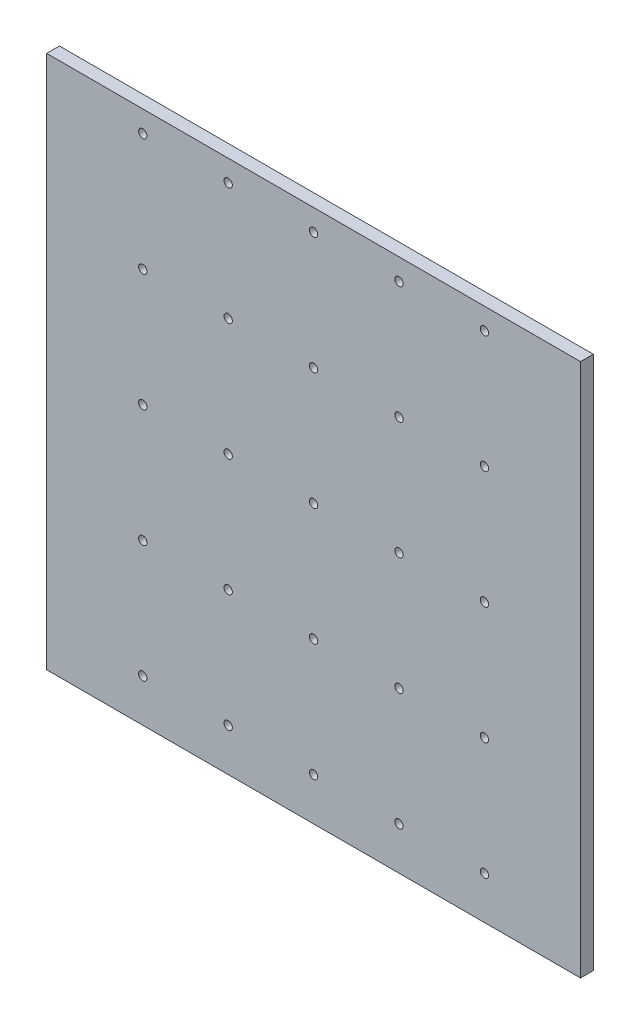
ISO-10303-21;
HEADER;
FILE_DESCRIPTION(('STEP AP214'),'2;1');
FILE_NAME('part.step','',(''),(''),'','','');
FILE_SCHEMA(('AUTOMOTIVE_DESIGN { 1 0 10303 214 1 1 1 1 }'));
ENDSEC;
DATA;
#1=APPLICATION_CONTEXT('core data for automotive mechanical design processes');
#2=APPLICATION_PROTOCOL_DEFINITION('international standard','automotive_design',2000,#1);
#3=PRODUCT_CONTEXT('',#1,'mechanical');
#4=PRODUCT('Part','Part','',(#3));
#5=PRODUCT_RELATED_PRODUCT_CATEGORY('part','',(#4));
#6=PRODUCT_DEFINITION_FORMATION('','',#4);
#7=PRODUCT_DEFINITION_CONTEXT('part definition',#1,'design');
#8=PRODUCT_DEFINITION('design','',#6,#7);
#9=PRODUCT_DEFINITION_SHAPE('','',#8);
#10=(LENGTH_UNIT() NAMED_UNIT(*) SI_UNIT(.MILLI.,.METRE.));
#11=(NAMED_UNIT(*) PLANE_ANGLE_UNIT() SI_UNIT($,.RADIAN.));
#12=(NAMED_UNIT(*) SI_UNIT($,.STERADIAN.) SOLID_ANGLE_UNIT());
#13=UNCERTAINTY_MEASURE_WITH_UNIT(LENGTH_MEASURE(1.E-05),#10,'distance_accuracy_value','');
#14=(GEOMETRIC_REPRESENTATION_CONTEXT(3) GLOBAL_UNCERTAINTY_ASSIGNED_CONTEXT((#13)) GLOBAL_UNIT_ASSIGNED_CONTEXT((#10,
#11,#12)) REPRESENTATION_CONTEXT('',''));
#15=CARTESIAN_POINT('',(0.,0.,0.));
#16=DIRECTION('',(0.,0.,1.));
#17=DIRECTION('',(1.,0.,0.));
#18=AXIS2_PLACEMENT_3D('',#15,#16,#17);
#19=CARTESIAN_POINT('',(0.,0.,0.));
#20=DIRECTION('',(0.,0.,-1.));
#21=DIRECTION('',(-1.,0.,0.));
#22=AXIS2_PLACEMENT_3D('',#19,#20,#21);
#23=PLANE('',#22);
#24=CARTESIAN_POINT('',(45.,185.,0.));
#25=DIRECTION('',(0.,0.,1.));
#26=DIRECTION('',(1.,0.,0.));
#27=AXIS2_PLACEMENT_3D('',#24,#25,#26);
#28=CIRCLE('',#27,1.95);
#29=CARTESIAN_POINT('',(46.95,185.,0.));
#30=VERTEX_POINT('',#29);
#31=EDGE_CURVE('E251',#30,#30,#28,.T.);
#32=ORIENTED_EDGE('',*,*,#31,.T.);
#33=EDGE_LOOP('',(#32));
#34=FACE_BOUND('',#33,.T.);
#35=CARTESIAN_POINT('',(45.,75.,0.));
#36=DIRECTION('',(0.,0.,1.));
#37=DIRECTION('',(1.,0.,0.));
#38=AXIS2_PLACEMENT_3D('',#35,#36,#37);
#39=CIRCLE('',#38,1.95);
#40=CARTESIAN_POINT('',(46.95,75.,0.));
#41=VERTEX_POINT('',#40);
#42=EDGE_CURVE('E259',#41,#41,#39,.T.);
#43=ORIENTED_EDGE('',*,*,#42,.T.);
#44=EDGE_LOOP('',(#43));
#45=FACE_BOUND('',#44,.T.);
#46=CARTESIAN_POINT('',(205.,240.,0.));
#47=DIRECTION('',(0.,0.,1.));
#48=DIRECTION('',(1.,0.,0.));
#49=AXIS2_PLACEMENT_3D('',#46,#47,#48);
#50=CIRCLE('',#49,1.94999999999999);
#51=CARTESIAN_POINT('',(206.95,240.,0.));
#52=VERTEX_POINT('',#51);
#53=EDGE_CURVE('E43',#52,#52,#50,.T.);
#54=ORIENTED_EDGE('',*,*,#53,.T.);
#55=EDGE_LOOP('',(#54));
#56=FACE_BOUND('',#55,.T.);
#57=CARTESIAN_POINT('',(165.,240.,0.));
#58=DIRECTION('',(0.,0.,1.));
#59=DIRECTION('',(1.,0.,0.));
#60=AXIS2_PLACEMENT_3D('',#57,#58,#59);
#61=CIRCLE('',#60,1.94999999999999);
#62=CARTESIAN_POINT('',(166.95,240.,0.));
#63=VERTEX_POINT('',#62);
#64=EDGE_CURVE('E206',#63,#63,#61,.T.);
#65=ORIENTED_EDGE('',*,*,#64,.T.);
#66=EDGE_LOOP('',(#65));
#67=FACE_BOUND('',#66,.T.);
#68=CARTESIAN_POINT('',(125.,240.,0.));
#69=DIRECTION('',(0.,0.,1.));
#70=DIRECTION('',(1.,0.,0.));
#71=AXIS2_PLACEMENT_3D('',#68,#69,#70);
#72=CIRCLE('',#71,1.94999999999999);
#73=CARTESIAN_POINT('',(126.95,240.,0.));
#74=VERTEX_POINT('',#73);
#75=EDGE_CURVE('E200',#74,#74,#72,.T.);
#76=ORIENTED_EDGE('',*,*,#75,.T.);
#77=EDGE_LOOP('',(#76));
#78=FACE_BOUND('',#77,.T.);
#79=CARTESIAN_POINT('',(85.,240.,0.));
#80=DIRECTION('',(0.,0.,1.));
#81=DIRECTION('',(1.,0.,0.));
#82=AXIS2_PLACEMENT_3D('',#79,#80,#81);
#83=CIRCLE('',#82,1.94999999999999);
#84=CARTESIAN_POINT('',(86.95,240.,0.));
#85=VERTEX_POINT('',#84);
#86=EDGE_CURVE('E194',#85,#85,#83,.T.);
#87=ORIENTED_EDGE('',*,*,#86,.T.);
#88=EDGE_LOOP('',(#87));
#89=FACE_BOUND('',#88,.T.);
#90=CARTESIAN_POINT('',(205.,185.,0.));
#91=DIRECTION('',(0.,0.,1.));
#92=DIRECTION('',(1.,0.,0.));
#93=AXIS2_PLACEMENT_3D('',#90,#91,#92);
#94=CIRCLE('',#93,1.94999999999999);
#95=CARTESIAN_POINT('',(206.95,185.,0.));
#96=VERTEX_POINT('',#95);
#97=EDGE_CURVE('E188',#96,#96,#94,.T.);
#98=ORIENTED_EDGE('',*,*,#97,.T.);
#99=EDGE_LOOP('',(#98));
#100=FACE_BOUND('',#99,.T.);
#101=CARTESIAN_POINT('',(85.,185.,0.));
#102=DIRECTION('',(0.,0.,1.));
#103=DIRECTION('',(1.,0.,0.));
#104=AXIS2_PLACEMENT_3D('',#101,#102,#103);
#105=CIRCLE('',#104,1.94999999999999);
#106=CARTESIAN_POINT('',(86.95,185.,0.));
#107=VERTEX_POINT('',#106);
#108=EDGE_CURVE('E182',#107,#107,#105,.T.);
#109=ORIENTED_EDGE('',*,*,#108,.T.);
#110=EDGE_LOOP('',(#109));
#111=FACE_BOUND('',#110,.T.);
#112=CARTESIAN_POINT('',(205.,130.,0.));
#113=DIRECTION('',(0.,0.,1.));
#114=DIRECTION('',(1.,0.,0.));
#115=AXIS2_PLACEMENT_3D('',#112,#113,#114);
#116=CIRCLE('',#115,1.94999999999999);
#117=CARTESIAN_POINT('',(206.95,130.,0.));
#118=VERTEX_POINT('',#117);
#119=EDGE_CURVE('E176',#118,#118,#116,.T.);
#120=ORIENTED_EDGE('',*,*,#119,.T.);
#121=EDGE_LOOP('',(#120));
#122=FACE_BOUND('',#121,.T.);
#123=CARTESIAN_POINT('',(85.,130.,0.));
#124=DIRECTION('',(0.,0.,1.));
#125=DIRECTION('',(1.,0.,0.));
#126=AXIS2_PLACEMENT_3D('',#123,#124,#125);
#127=CIRCLE('',#126,1.94999999999999);
#128=CARTESIAN_POINT('',(86.95,130.,0.));
#129=VERTEX_POINT('',#128);
#130=EDGE_CURVE('E170',#129,#129,#127,.T.);
#131=ORIENTED_EDGE('',*,*,#130,.T.);
#132=EDGE_LOOP('',(#131));
#133=FACE_BOUND('',#132,.T.);
#134=CARTESIAN_POINT('',(205.,75.,0.));
#135=DIRECTION('',(0.,0.,1.));
#136=DIRECTION('',(1.,0.,0.));
#137=AXIS2_PLACEMENT_3D('',#134,#135,#136);
#138=CIRCLE('',#137,1.94999999999999);
#139=CARTESIAN_POINT('',(206.95,75.,0.));
#140=VERTEX_POINT('',#139);
#141=EDGE_CURVE('E164',#140,#140,#138,.T.);
#142=ORIENTED_EDGE('',*,*,#141,.T.);
#143=EDGE_LOOP('',(#142));
#144=FACE_BOUND('',#143,.T.);
#145=CARTESIAN_POINT('',(85.,75.,0.));
#146=DIRECTION('',(0.,0.,1.));
#147=DIRECTION('',(1.,0.,0.));
#148=AXIS2_PLACEMENT_3D('',#145,#146,#147);
#149=CIRCLE('',#148,1.94999999999999);
#150=CARTESIAN_POINT('',(86.95,75.,0.));
#151=VERTEX_POINT('',#150);
#152=EDGE_CURVE('E158',#151,#151,#149,.T.);
#153=ORIENTED_EDGE('',*,*,#152,.T.);
#154=EDGE_LOOP('',(#153));
#155=FACE_BOUND('',#154,.T.);
#156=CARTESIAN_POINT('',(205.,20.,0.));
#157=DIRECTION('',(0.,0.,1.));
#158=DIRECTION('',(1.,0.,0.));
#159=AXIS2_PLACEMENT_3D('',#156,#157,#158);
#160=CIRCLE('',#159,1.94999999999999);
#161=CARTESIAN_POINT('',(206.95,20.,0.));
#162=VERTEX_POINT('',#161);
#163=EDGE_CURVE('E152',#162,#162,#160,.T.);
#164=ORIENTED_EDGE('',*,*,#163,.T.);
#165=EDGE_LOOP('',(#164));
#166=FACE_BOUND('',#165,.T.);
#167=CARTESIAN_POINT('',(165.,20.,0.));
#168=DIRECTION('',(0.,0.,1.));
#169=DIRECTION('',(1.,0.,0.));
#170=AXIS2_PLACEMENT_3D('',#167,#168,#169);
#171=CIRCLE('',#170,1.94999999999999);
#172=CARTESIAN_POINT('',(166.95,20.,0.));
#173=VERTEX_POINT('',#172);
#174=EDGE_CURVE('E146',#173,#173,#171,.T.);
#175=ORIENTED_EDGE('',*,*,#174,.T.);
#176=EDGE_LOOP('',(#175));
#177=FACE_BOUND('',#176,.T.);
#178=CARTESIAN_POINT('',(165.,185.,0.));
#179=DIRECTION('',(0.,0.,1.));
#180=DIRECTION('',(1.,0.,0.));
#181=AXIS2_PLACEMENT_3D('',#178,#179,#180);
#182=CIRCLE('',#181,1.94999999999999);
#183=CARTESIAN_POINT('',(166.95,185.,0.));
#184=VERTEX_POINT('',#183);
#185=EDGE_CURVE('E140',#184,#184,#182,.T.);
#186=ORIENTED_EDGE('',*,*,#185,.T.);
#187=EDGE_LOOP('',(#186));
#188=FACE_BOUND('',#187,.T.);
#189=CARTESIAN_POINT('',(125.,185.,0.));
#190=DIRECTION('',(0.,0.,1.));
#191=DIRECTION('',(1.,0.,0.));
#192=AXIS2_PLACEMENT_3D('',#189,#190,#191);
#193=CIRCLE('',#192,1.94999999999999);
#194=CARTESIAN_POINT('',(126.95,185.,0.));
#195=VERTEX_POINT('',#194);
#196=EDGE_CURVE('E134',#195,#195,#193,.T.);
#197=ORIENTED_EDGE('',*,*,#196,.T.);
#198=EDGE_LOOP('',(#197));
#199=FACE_BOUND('',#198,.T.);
#200=CARTESIAN_POINT('',(165.,130.,0.));
#201=DIRECTION('',(0.,0.,1.));
#202=DIRECTION('',(1.,0.,0.));
#203=AXIS2_PLACEMENT_3D('',#200,#201,#202);
#204=CIRCLE('',#203,1.94999999999999);
#205=CARTESIAN_POINT('',(166.95,130.,0.));
#206=VERTEX_POINT('',#205);
#207=EDGE_CURVE('E128',#206,#206,#204,.T.);
#208=ORIENTED_EDGE('',*,*,#207,.T.);
#209=EDGE_LOOP('',(#208));
#210=FACE_BOUND('',#209,.T.);
#211=CARTESIAN_POINT('',(125.,130.,0.));
#212=DIRECTION('',(0.,0.,1.));
#213=DIRECTION('',(1.,0.,0.));
#214=AXIS2_PLACEMENT_3D('',#211,#212,#213);
#215=CIRCLE('',#214,1.94999999999999);
#216=CARTESIAN_POINT('',(126.95,130.,0.));
#217=VERTEX_POINT('',#216);
#218=EDGE_CURVE('E122',#217,#217,#215,.T.);
#219=ORIENTED_EDGE('',*,*,#218,.T.);
#220=EDGE_LOOP('',(#219));
#221=FACE_BOUND('',#220,.T.);
#222=CARTESIAN_POINT('',(165.,75.,0.));
#223=DIRECTION('',(0.,0.,1.));
#224=DIRECTION('',(1.,0.,0.));
#225=AXIS2_PLACEMENT_3D('',#222,#223,#224);
#226=CIRCLE('',#225,1.94999999999999);
#227=CARTESIAN_POINT('',(166.95,75.,0.));
#228=VERTEX_POINT('',#227);
#229=EDGE_CURVE('E114',#228,#228,#226,.T.);
#230=ORIENTED_EDGE('',*,*,#229,.T.);
#231=EDGE_LOOP('',(#230));
#232=FACE_BOUND('',#231,.T.);
#233=DIRECTION('',(0.,1.,0.));
#234=VECTOR('',#233,1.);
#235=CARTESIAN_POINT('',(0.,0.,0.));
#236=LINE('',#235,#234);
#237=CARTESIAN_POINT('',(0.,0.,0.));
#238=VERTEX_POINT('',#237);
#239=CARTESIAN_POINT('',(0.,250.,0.));
#240=VERTEX_POINT('',#239);
#241=EDGE_CURVE('E105',#238,#240,#236,.T.);
#242=ORIENTED_EDGE('',*,*,#241,.T.);
#243=DIRECTION('',(1.,0.,0.));
#244=VECTOR('',#243,1.);
#245=CARTESIAN_POINT('',(0.,250.,0.));
#246=LINE('',#245,#244);
#247=CARTESIAN_POINT('',(250.,250.,0.));
#248=VERTEX_POINT('',#247);
#249=EDGE_CURVE('E108',#240,#248,#246,.T.);
#250=ORIENTED_EDGE('',*,*,#249,.T.);
#251=DIRECTION('',(0.,1.,0.));
#252=VECTOR('',#251,1.);
#253=CARTESIAN_POINT('',(250.,0.,0.));
#254=LINE('',#253,#252);
#255=CARTESIAN_POINT('',(250.,0.,0.));
#256=VERTEX_POINT('',#255);
#257=EDGE_CURVE('E94',#256,#248,#254,.T.);
#258=ORIENTED_EDGE('',*,*,#257,.F.);
#259=DIRECTION('',(1.,0.,0.));
#260=VECTOR('',#259,1.);
#261=CARTESIAN_POINT('',(0.,0.,0.));
#262=LINE('',#261,#260);
#263=EDGE_CURVE('E68',#238,#256,#262,.T.);
#264=ORIENTED_EDGE('',*,*,#263,.F.);
#265=EDGE_LOOP('',(#242,#250,#258,#264));
#266=FACE_BOUND('',#265,.T.);
#267=CARTESIAN_POINT('',(85.,20.,0.));
#268=DIRECTION('',(0.,0.,1.));
#269=DIRECTION('',(1.,0.,0.));
#270=AXIS2_PLACEMENT_3D('',#267,#268,#269);
#271=CIRCLE('',#270,1.94999999999999);
#272=CARTESIAN_POINT('',(86.95,20.,0.));
#273=VERTEX_POINT('',#272);
#274=EDGE_CURVE('E109',#273,#273,#271,.T.);
#275=ORIENTED_EDGE('',*,*,#274,.T.);
#276=EDGE_LOOP('',(#275));
#277=FACE_BOUND('',#276,.T.);
#278=CARTESIAN_POINT('',(125.,75.,0.));
#279=DIRECTION('',(0.,0.,1.));
#280=DIRECTION('',(1.,0.,0.));
#281=AXIS2_PLACEMENT_3D('',#278,#279,#280);
#282=CIRCLE('',#281,1.94999999999999);
#283=CARTESIAN_POINT('',(126.95,75.,0.));
#284=VERTEX_POINT('',#283);
#285=EDGE_CURVE('E272',#284,#284,#282,.T.);
#286=ORIENTED_EDGE('',*,*,#285,.T.);
#287=EDGE_LOOP('',(#286));
#288=FACE_BOUND('',#287,.T.);
#289=CARTESIAN_POINT('',(125.,20.,0.));
#290=DIRECTION('',(0.,0.,1.));
#291=DIRECTION('',(1.,0.,0.));
#292=AXIS2_PLACEMENT_3D('',#289,#290,#291);
#293=CIRCLE('',#292,1.94999999999999);
#294=CARTESIAN_POINT('',(126.95,20.,0.));
#295=VERTEX_POINT('',#294);
#296=EDGE_CURVE('E266',#295,#295,#293,.T.);
#297=ORIENTED_EDGE('',*,*,#296,.T.);
#298=EDGE_LOOP('',(#297));
#299=FACE_BOUND('',#298,.T.);
#300=CARTESIAN_POINT('',(45.,20.,0.));
#301=DIRECTION('',(0.,0.,1.));
#302=DIRECTION('',(1.,0.,0.));
#303=AXIS2_PLACEMENT_3D('',#300,#301,#302);
#304=CIRCLE('',#303,1.95);
#305=CARTESIAN_POINT('',(46.95,20.,0.));
#306=VERTEX_POINT('',#305);
#307=EDGE_CURVE('E263',#306,#306,#304,.T.);
#308=ORIENTED_EDGE('',*,*,#307,.T.);
#309=EDGE_LOOP('',(#308));
#310=FACE_BOUND('',#309,.T.);
#311=CARTESIAN_POINT('',(45.,130.,0.));
#312=DIRECTION('',(0.,0.,1.));
#313=DIRECTION('',(1.,0.,0.));
#314=AXIS2_PLACEMENT_3D('',#311,#312,#313);
#315=CIRCLE('',#314,1.95);
#316=CARTESIAN_POINT('',(46.95,130.,0.));
#317=VERTEX_POINT('',#316);
#318=EDGE_CURVE('E255',#317,#317,#315,.T.);
#319=ORIENTED_EDGE('',*,*,#318,.T.);
#320=EDGE_LOOP('',(#319));
#321=FACE_BOUND('',#320,.T.);
#322=CARTESIAN_POINT('',(45.,240.,0.));
#323=DIRECTION('',(0.,0.,1.));
#324=DIRECTION('',(1.,0.,0.));
#325=AXIS2_PLACEMENT_3D('',#322,#323,#324);
#326=CIRCLE('',#325,1.95);
#327=CARTESIAN_POINT('',(46.95,240.,0.));
#328=VERTEX_POINT('',#327);
#329=EDGE_CURVE('E245',#328,#328,#326,.T.);
#330=ORIENTED_EDGE('',*,*,#329,.T.);
#331=EDGE_LOOP('',(#330));
#332=FACE_BOUND('',#331,.T.);
#333=ADVANCED_FACE('F34',(#34,#45,#56,#67,#78,#89,#100,#111,#122,#133,#144,#155,#166,#177,#188,
#199,#210,#221,#232,#266,#277,#288,#299,#310,#321,#332),#23,.T.);
#334=CARTESIAN_POINT('',(0.,0.,6.));
#335=DIRECTION('',(0.,0.,-1.));
#336=DIRECTION('',(-1.,0.,0.));
#337=AXIS2_PLACEMENT_3D('',#334,#335,#336);
#338=PLANE('',#337);
#339=CARTESIAN_POINT('',(125.,20.,6.));
#340=DIRECTION('',(0.,0.,1.));
#341=DIRECTION('',(1.,0.,0.));
#342=AXIS2_PLACEMENT_3D('',#339,#340,#341);
#343=CIRCLE('',#342,1.94999999999999);
#344=CARTESIAN_POINT('',(126.95,20.,6.));
#345=VERTEX_POINT('',#344);
#346=EDGE_CURVE('E269',#345,#345,#343,.T.);
#347=ORIENTED_EDGE('',*,*,#346,.F.);
#348=EDGE_LOOP('',(#347));
#349=FACE_BOUND('',#348,.T.);
#350=CARTESIAN_POINT('',(125.,75.,6.));
#351=DIRECTION('',(0.,0.,1.));
#352=DIRECTION('',(1.,0.,0.));
#353=AXIS2_PLACEMENT_3D('',#350,#351,#352);
#354=CIRCLE('',#353,1.94999999999999);
#355=CARTESIAN_POINT('',(126.95,75.,6.));
#356=VERTEX_POINT('',#355);
#357=EDGE_CURVE('E275',#356,#356,#354,.T.);
#358=ORIENTED_EDGE('',*,*,#357,.F.);
#359=EDGE_LOOP('',(#358));
#360=FACE_BOUND('',#359,.T.);
#361=CARTESIAN_POINT('',(85.,20.,6.));
#362=DIRECTION('',(0.,0.,1.));
#363=DIRECTION('',(1.,0.,0.));
#364=AXIS2_PLACEMENT_3D('',#361,#362,#363);
#365=CIRCLE('',#364,1.94999999999999);
#366=CARTESIAN_POINT('',(86.95,20.,6.));
#367=VERTEX_POINT('',#366);
#368=EDGE_CURVE('E278',#367,#367,#365,.T.);
#369=ORIENTED_EDGE('',*,*,#368,.F.);
#370=EDGE_LOOP('',(#369));
#371=FACE_BOUND('',#370,.T.);
#372=DIRECTION('',(0.,1.,0.));
#373=VECTOR('',#372,1.);
#374=CARTESIAN_POINT('',(0.,0.,6.));
#375=LINE('',#374,#373);
#376=CARTESIAN_POINT('',(0.,0.,6.));
#377=VERTEX_POINT('',#376);
#378=CARTESIAN_POINT('',(0.,250.,6.));
#379=VERTEX_POINT('',#378);
#380=EDGE_CURVE('E99',#377,#379,#375,.T.);
#381=ORIENTED_EDGE('',*,*,#380,.F.);
#382=DIRECTION('',(1.,0.,0.));
#383=VECTOR('',#382,1.);
#384=CARTESIAN_POINT('',(0.,0.,6.));
#385=LINE('',#384,#383);
#386=CARTESIAN_POINT('',(250.,0.,6.));
#387=VERTEX_POINT('',#386);
#388=EDGE_CURVE('E87',#377,#387,#385,.T.);
#389=ORIENTED_EDGE('',*,*,#388,.T.);
#390=DIRECTION('',(0.,1.,0.));
#391=VECTOR('',#390,1.);
#392=CARTESIAN_POINT('',(250.,0.,6.));
#393=LINE('',#392,#391);
#394=CARTESIAN_POINT('',(250.,250.,6.));
#395=VERTEX_POINT('',#394);
#396=EDGE_CURVE('E81',#387,#395,#393,.T.);
#397=ORIENTED_EDGE('',*,*,#396,.T.);
#398=DIRECTION('',(1.,0.,0.));
#399=VECTOR('',#398,1.);
#400=CARTESIAN_POINT('',(0.,250.,6.));
#401=LINE('',#400,#399);
#402=EDGE_CURVE('E86',#379,#395,#401,.T.);
#403=ORIENTED_EDGE('',*,*,#402,.F.);
#404=EDGE_LOOP('',(#381,#389,#397,#403));
#405=FACE_BOUND('',#404,.T.);
#406=CARTESIAN_POINT('',(165.,75.,6.));
#407=DIRECTION('',(0.,0.,1.));
#408=DIRECTION('',(1.,0.,0.));
#409=AXIS2_PLACEMENT_3D('',#406,#407,#408);
#410=CIRCLE('',#409,1.94999999999999);
#411=CARTESIAN_POINT('',(166.95,75.,6.));
#412=VERTEX_POINT('',#411);
#413=EDGE_CURVE('E119',#412,#412,#410,.T.);
#414=ORIENTED_EDGE('',*,*,#413,.F.);
#415=EDGE_LOOP('',(#414));
#416=FACE_BOUND('',#415,.T.);
#417=CARTESIAN_POINT('',(125.,130.,6.));
#418=DIRECTION('',(0.,0.,1.));
#419=DIRECTION('',(1.,0.,0.));
#420=AXIS2_PLACEMENT_3D('',#417,#418,#419);
#421=CIRCLE('',#420,1.94999999999999);
#422=CARTESIAN_POINT('',(126.95,130.,6.));
#423=VERTEX_POINT('',#422);
#424=EDGE_CURVE('E125',#423,#423,#421,.T.);
#425=ORIENTED_EDGE('',*,*,#424,.F.);
#426=EDGE_LOOP('',(#425));
#427=FACE_BOUND('',#426,.T.);
#428=CARTESIAN_POINT('',(165.,130.,6.));
#429=DIRECTION('',(0.,0.,1.));
#430=DIRECTION('',(1.,0.,0.));
#431=AXIS2_PLACEMENT_3D('',#428,#429,#430);
#432=CIRCLE('',#431,1.94999999999999);
#433=CARTESIAN_POINT('',(166.95,130.,6.));
#434=VERTEX_POINT('',#433);
#435=EDGE_CURVE('E131',#434,#434,#432,.T.);
#436=ORIENTED_EDGE('',*,*,#435,.F.);
#437=EDGE_LOOP('',(#436));
#438=FACE_BOUND('',#437,.T.);
#439=CARTESIAN_POINT('',(125.,185.,6.));
#440=DIRECTION('',(0.,0.,1.));
#441=DIRECTION('',(1.,0.,0.));
#442=AXIS2_PLACEMENT_3D('',#439,#440,#441);
#443=CIRCLE('',#442,1.94999999999999);
#444=CARTESIAN_POINT('',(126.95,185.,6.));
#445=VERTEX_POINT('',#444);
#446=EDGE_CURVE('E137',#445,#445,#443,.T.);
#447=ORIENTED_EDGE('',*,*,#446,.F.);
#448=EDGE_LOOP('',(#447));
#449=FACE_BOUND('',#448,.T.);
#450=CARTESIAN_POINT('',(165.,185.,6.));
#451=DIRECTION('',(0.,0.,1.));
#452=DIRECTION('',(1.,0.,0.));
#453=AXIS2_PLACEMENT_3D('',#450,#451,#452);
#454=CIRCLE('',#453,1.94999999999999);
#455=CARTESIAN_POINT('',(166.95,185.,6.));
#456=VERTEX_POINT('',#455);
#457=EDGE_CURVE('E143',#456,#456,#454,.T.);
#458=ORIENTED_EDGE('',*,*,#457,.F.);
#459=EDGE_LOOP('',(#458));
#460=FACE_BOUND('',#459,.T.);
#461=CARTESIAN_POINT('',(165.,20.,6.));
#462=DIRECTION('',(0.,0.,1.));
#463=DIRECTION('',(1.,0.,0.));
#464=AXIS2_PLACEMENT_3D('',#461,#462,#463);
#465=CIRCLE('',#464,1.94999999999999);
#466=CARTESIAN_POINT('',(166.95,20.,6.));
#467=VERTEX_POINT('',#466);
#468=EDGE_CURVE('E149',#467,#467,#465,.T.);
#469=ORIENTED_EDGE('',*,*,#468,.F.);
#470=EDGE_LOOP('',(#469));
#471=FACE_BOUND('',#470,.T.);
#472=CARTESIAN_POINT('',(205.,20.,6.));
#473=DIRECTION('',(0.,0.,1.));
#474=DIRECTION('',(1.,0.,0.));
#475=AXIS2_PLACEMENT_3D('',#472,#473,#474);
#476=CIRCLE('',#475,1.94999999999999);
#477=CARTESIAN_POINT('',(206.95,20.,6.));
#478=VERTEX_POINT('',#477);
#479=EDGE_CURVE('E155',#478,#478,#476,.T.);
#480=ORIENTED_EDGE('',*,*,#479,.F.);
#481=EDGE_LOOP('',(#480));
#482=FACE_BOUND('',#481,.T.);
#483=CARTESIAN_POINT('',(85.,75.,6.));
#484=DIRECTION('',(0.,0.,1.));
#485=DIRECTION('',(1.,0.,0.));
#486=AXIS2_PLACEMENT_3D('',#483,#484,#485);
#487=CIRCLE('',#486,1.94999999999999);
#488=CARTESIAN_POINT('',(86.95,75.,6.));
#489=VERTEX_POINT('',#488);
#490=EDGE_CURVE('E161',#489,#489,#487,.T.);
#491=ORIENTED_EDGE('',*,*,#490,.F.);
#492=EDGE_LOOP('',(#491));
#493=FACE_BOUND('',#492,.T.);
#494=CARTESIAN_POINT('',(205.,75.,6.));
#495=DIRECTION('',(0.,0.,1.));
#496=DIRECTION('',(1.,0.,0.));
#497=AXIS2_PLACEMENT_3D('',#494,#495,#496);
#498=CIRCLE('',#497,1.94999999999999);
#499=CARTESIAN_POINT('',(206.95,75.,6.));
#500=VERTEX_POINT('',#499);
#501=EDGE_CURVE('E167',#500,#500,#498,.T.);
#502=ORIENTED_EDGE('',*,*,#501,.F.);
#503=EDGE_LOOP('',(#502));
#504=FACE_BOUND('',#503,.T.);
#505=CARTESIAN_POINT('',(85.,130.,6.));
#506=DIRECTION('',(0.,0.,1.));
#507=DIRECTION('',(1.,0.,0.));
#508=AXIS2_PLACEMENT_3D('',#505,#506,#507);
#509=CIRCLE('',#508,1.94999999999999);
#510=CARTESIAN_POINT('',(86.95,130.,6.));
#511=VERTEX_POINT('',#510);
#512=EDGE_CURVE('E173',#511,#511,#509,.T.);
#513=ORIENTED_EDGE('',*,*,#512,.F.);
#514=EDGE_LOOP('',(#513));
#515=FACE_BOUND('',#514,.T.);
#516=CARTESIAN_POINT('',(205.,130.,6.));
#517=DIRECTION('',(0.,0.,1.));
#518=DIRECTION('',(1.,0.,0.));
#519=AXIS2_PLACEMENT_3D('',#516,#517,#518);
#520=CIRCLE('',#519,1.94999999999999);
#521=CARTESIAN_POINT('',(206.95,130.,6.));
#522=VERTEX_POINT('',#521);
#523=EDGE_CURVE('E179',#522,#522,#520,.T.);
#524=ORIENTED_EDGE('',*,*,#523,.F.);
#525=EDGE_LOOP('',(#524));
#526=FACE_BOUND('',#525,.T.);
#527=CARTESIAN_POINT('',(85.,185.,6.));
#528=DIRECTION('',(0.,0.,1.));
#529=DIRECTION('',(1.,0.,0.));
#530=AXIS2_PLACEMENT_3D('',#527,#528,#529);
#531=CIRCLE('',#530,1.94999999999999);
#532=CARTESIAN_POINT('',(86.95,185.,6.));
#533=VERTEX_POINT('',#532);
#534=EDGE_CURVE('E185',#533,#533,#531,.T.);
#535=ORIENTED_EDGE('',*,*,#534,.F.);
#536=EDGE_LOOP('',(#535));
#537=FACE_BOUND('',#536,.T.);
#538=CARTESIAN_POINT('',(205.,185.,6.));
#539=DIRECTION('',(0.,0.,1.));
#540=DIRECTION('',(1.,0.,0.));
#541=AXIS2_PLACEMENT_3D('',#538,#539,#540);
#542=CIRCLE('',#541,1.94999999999999);
#543=CARTESIAN_POINT('',(206.95,185.,6.));
#544=VERTEX_POINT('',#543);
#545=EDGE_CURVE('E191',#544,#544,#542,.T.);
#546=ORIENTED_EDGE('',*,*,#545,.F.);
#547=EDGE_LOOP('',(#546));
#548=FACE_BOUND('',#547,.T.);
#549=CARTESIAN_POINT('',(85.,240.,6.));
#550=DIRECTION('',(0.,0.,1.));
#551=DIRECTION('',(1.,0.,0.));
#552=AXIS2_PLACEMENT_3D('',#549,#550,#551);
#553=CIRCLE('',#552,1.94999999999999);
#554=CARTESIAN_POINT('',(86.95,240.,6.));
#555=VERTEX_POINT('',#554);
#556=EDGE_CURVE('E197',#555,#555,#553,.T.);
#557=ORIENTED_EDGE('',*,*,#556,.F.);
#558=EDGE_LOOP('',(#557));
#559=FACE_BOUND('',#558,.T.);
#560=CARTESIAN_POINT('',(125.,240.,6.));
#561=DIRECTION('',(0.,0.,1.));
#562=DIRECTION('',(1.,0.,0.));
#563=AXIS2_PLACEMENT_3D('',#560,#561,#562);
#564=CIRCLE('',#563,1.94999999999999);
#565=CARTESIAN_POINT('',(126.95,240.,6.));
#566=VERTEX_POINT('',#565);
#567=EDGE_CURVE('E203',#566,#566,#564,.T.);
#568=ORIENTED_EDGE('',*,*,#567,.F.);
#569=EDGE_LOOP('',(#568));
#570=FACE_BOUND('',#569,.T.);
#571=CARTESIAN_POINT('',(165.,240.,6.));
#572=DIRECTION('',(0.,0.,1.));
#573=DIRECTION('',(1.,0.,0.));
#574=AXIS2_PLACEMENT_3D('',#571,#572,#573);
#575=CIRCLE('',#574,1.94999999999999);
#576=CARTESIAN_POINT('',(166.95,240.,6.));
#577=VERTEX_POINT('',#576);
#578=EDGE_CURVE('E209',#577,#577,#575,.T.);
#579=ORIENTED_EDGE('',*,*,#578,.F.);
#580=EDGE_LOOP('',(#579));
#581=FACE_BOUND('',#580,.T.);
#582=CARTESIAN_POINT('',(205.,240.,6.));
#583=DIRECTION('',(0.,0.,1.));
#584=DIRECTION('',(1.,0.,0.));
#585=AXIS2_PLACEMENT_3D('',#582,#583,#584);
#586=CIRCLE('',#585,1.94999999999999);
#587=CARTESIAN_POINT('',(206.95,240.,6.));
#588=VERTEX_POINT('',#587);
#589=EDGE_CURVE('E11',#588,#588,#586,.T.);
#590=ORIENTED_EDGE('',*,*,#589,.F.);
#591=EDGE_LOOP('',(#590));
#592=FACE_BOUND('',#591,.T.);
#593=CARTESIAN_POINT('',(45.,20.,6.));
#594=DIRECTION('',(0.,0.,1.));
#595=DIRECTION('',(1.,0.,0.));
#596=AXIS2_PLACEMENT_3D('',#593,#594,#595);
#597=CIRCLE('',#596,1.94999999999999);
#598=CARTESIAN_POINT('',(46.95,20.,6.));
#599=VERTEX_POINT('',#598);
#600=EDGE_CURVE('E228',#599,#599,#597,.T.);
#601=ORIENTED_EDGE('',*,*,#600,.F.);
#602=EDGE_LOOP('',(#601));
#603=FACE_BOUND('',#602,.T.);
#604=CARTESIAN_POINT('',(45.,75.,6.));
#605=DIRECTION('',(0.,0.,1.));
#606=DIRECTION('',(1.,0.,0.));
#607=AXIS2_PLACEMENT_3D('',#604,#605,#606);
#608=CIRCLE('',#607,1.94999999999999);
#609=CARTESIAN_POINT('',(46.95,75.,6.));
#610=VERTEX_POINT('',#609);
#611=EDGE_CURVE('E232',#610,#610,#608,.T.);
#612=ORIENTED_EDGE('',*,*,#611,.F.);
#613=EDGE_LOOP('',(#612));
#614=FACE_BOUND('',#613,.T.);
#615=CARTESIAN_POINT('',(45.,130.,6.));
#616=DIRECTION('',(0.,0.,1.));
#617=DIRECTION('',(1.,0.,0.));
#618=AXIS2_PLACEMENT_3D('',#615,#616,#617);
#619=CIRCLE('',#618,1.94999999999999);
#620=CARTESIAN_POINT('',(46.95,130.,6.));
#621=VERTEX_POINT('',#620);
#622=EDGE_CURVE('E236',#621,#621,#619,.T.);
#623=ORIENTED_EDGE('',*,*,#622,.F.);
#624=EDGE_LOOP('',(#623));
#625=FACE_BOUND('',#624,.T.);
#626=CARTESIAN_POINT('',(45.,185.,6.));
#627=DIRECTION('',(0.,0.,1.));
#628=DIRECTION('',(1.,0.,0.));
#629=AXIS2_PLACEMENT_3D('',#626,#627,#628);
#630=CIRCLE('',#629,1.94999999999999);
#631=CARTESIAN_POINT('',(46.95,185.,6.));
#632=VERTEX_POINT('',#631);
#633=EDGE_CURVE('E240',#632,#632,#630,.T.);
#634=ORIENTED_EDGE('',*,*,#633,.F.);
#635=EDGE_LOOP('',(#634));
#636=FACE_BOUND('',#635,.T.);
#637=CARTESIAN_POINT('',(45.,240.,6.));
#638=DIRECTION('',(0.,0.,1.));
#639=DIRECTION('',(1.,0.,0.));
#640=AXIS2_PLACEMENT_3D('',#637,#638,#639);
#641=CIRCLE('',#640,1.94999999999999);
#642=CARTESIAN_POINT('',(46.95,240.,6.));
#643=VERTEX_POINT('',#642);
#644=EDGE_CURVE('E243',#643,#643,#641,.T.);
#645=ORIENTED_EDGE('',*,*,#644,.F.);
#646=EDGE_LOOP('',(#645));
#647=FACE_BOUND('',#646,.T.);
#648=ADVANCED_FACE('F84',(#349,#360,#371,#405,#416,#427,#438,#449,#460,#471,#482,#493,#504,#515,
#526,#537,#548,#559,#570,#581,#592,#603,#614,#625,#636,#647),#338,.F.);
#649=CARTESIAN_POINT('',(205.,240.,6.));
#650=DIRECTION('',(0.,0.,1.));
#651=DIRECTION('',(1.,0.,0.));
#652=AXIS2_PLACEMENT_3D('',#649,#650,#651);
#653=CYLINDRICAL_SURFACE('',#652,1.94999999999999);
#654=ORIENTED_EDGE('',*,*,#53,.F.);
#655=EDGE_LOOP('',(#654));
#656=FACE_BOUND('',#655,.T.);
#657=ORIENTED_EDGE('',*,*,#589,.T.);
#658=EDGE_LOOP('',(#657));
#659=FACE_BOUND('',#658,.T.);
#660=ADVANCED_FACE('F36',(#656,#659),#653,.F.);
#661=CARTESIAN_POINT('',(165.,240.,6.));
#662=DIRECTION('',(0.,0.,1.));
#663=DIRECTION('',(1.,0.,0.));
#664=AXIS2_PLACEMENT_3D('',#661,#662,#663);
#665=CYLINDRICAL_SURFACE('',#664,1.94999999999999);
#666=ORIENTED_EDGE('',*,*,#64,.F.);
#667=EDGE_LOOP('',(#666));
#668=FACE_BOUND('',#667,.T.);
#669=ORIENTED_EDGE('',*,*,#578,.T.);
#670=EDGE_LOOP('',(#669));
#671=FACE_BOUND('',#670,.T.);
#672=ADVANCED_FACE('F218',(#668,#671),#665,.F.);
#673=CARTESIAN_POINT('',(125.,240.,6.));
#674=DIRECTION('',(0.,0.,1.));
#675=DIRECTION('',(1.,0.,0.));
#676=AXIS2_PLACEMENT_3D('',#673,#674,#675);
#677=CYLINDRICAL_SURFACE('',#676,1.94999999999999);
#678=ORIENTED_EDGE('',*,*,#75,.F.);
#679=EDGE_LOOP('',(#678));
#680=FACE_BOUND('',#679,.T.);
#681=ORIENTED_EDGE('',*,*,#567,.T.);
#682=EDGE_LOOP('',(#681));
#683=FACE_BOUND('',#682,.T.);
#684=ADVANCED_FACE('F371',(#680,#683),#677,.F.);
#685=CARTESIAN_POINT('',(85.,240.,6.));
#686=DIRECTION('',(0.,0.,1.));
#687=DIRECTION('',(1.,0.,0.));
#688=AXIS2_PLACEMENT_3D('',#685,#686,#687);
#689=CYLINDRICAL_SURFACE('',#688,1.94999999999999);
#690=ORIENTED_EDGE('',*,*,#86,.F.);
#691=EDGE_LOOP('',(#690));
#692=FACE_BOUND('',#691,.T.);
#693=ORIENTED_EDGE('',*,*,#556,.T.);
#694=EDGE_LOOP('',(#693));
#695=FACE_BOUND('',#694,.T.);
#696=ADVANCED_FACE('F367',(#692,#695),#689,.F.);
#697=CARTESIAN_POINT('',(205.,185.,6.));
#698=DIRECTION('',(0.,0.,1.));
#699=DIRECTION('',(1.,0.,0.));
#700=AXIS2_PLACEMENT_3D('',#697,#698,#699);
#701=CYLINDRICAL_SURFACE('',#700,1.94999999999999);
#702=ORIENTED_EDGE('',*,*,#97,.F.);
#703=EDGE_LOOP('',(#702));
#704=FACE_BOUND('',#703,.T.);
#705=ORIENTED_EDGE('',*,*,#545,.T.);
#706=EDGE_LOOP('',(#705));
#707=FACE_BOUND('',#706,.T.);
#708=ADVANCED_FACE('F363',(#704,#707),#701,.F.);
#709=CARTESIAN_POINT('',(85.,185.,6.));
#710=DIRECTION('',(0.,0.,1.));
#711=DIRECTION('',(1.,0.,0.));
#712=AXIS2_PLACEMENT_3D('',#709,#710,#711);
#713=CYLINDRICAL_SURFACE('',#712,1.94999999999999);
#714=ORIENTED_EDGE('',*,*,#108,.F.);
#715=EDGE_LOOP('',(#714));
#716=FACE_BOUND('',#715,.T.);
#717=ORIENTED_EDGE('',*,*,#534,.T.);
#718=EDGE_LOOP('',(#717));
#719=FACE_BOUND('',#718,.T.);
#720=ADVANCED_FACE('F359',(#716,#719),#713,.F.);
#721=CARTESIAN_POINT('',(205.,130.,6.));
#722=DIRECTION('',(0.,0.,1.));
#723=DIRECTION('',(1.,0.,0.));
#724=AXIS2_PLACEMENT_3D('',#721,#722,#723);
#725=CYLINDRICAL_SURFACE('',#724,1.94999999999999);
#726=ORIENTED_EDGE('',*,*,#119,.F.);
#727=EDGE_LOOP('',(#726));
#728=FACE_BOUND('',#727,.T.);
#729=ORIENTED_EDGE('',*,*,#523,.T.);
#730=EDGE_LOOP('',(#729));
#731=FACE_BOUND('',#730,.T.);
#732=ADVANCED_FACE('F355',(#728,#731),#725,.F.);
#733=CARTESIAN_POINT('',(85.,130.,6.));
#734=DIRECTION('',(0.,0.,1.));
#735=DIRECTION('',(1.,0.,0.));
#736=AXIS2_PLACEMENT_3D('',#733,#734,#735);
#737=CYLINDRICAL_SURFACE('',#736,1.94999999999999);
#738=ORIENTED_EDGE('',*,*,#130,.F.);
#739=EDGE_LOOP('',(#738));
#740=FACE_BOUND('',#739,.T.);
#741=ORIENTED_EDGE('',*,*,#512,.T.);
#742=EDGE_LOOP('',(#741));
#743=FACE_BOUND('',#742,.T.);
#744=ADVANCED_FACE('F351',(#740,#743),#737,.F.);
#745=CARTESIAN_POINT('',(205.,75.,6.));
#746=DIRECTION('',(0.,0.,1.));
#747=DIRECTION('',(1.,0.,0.));
#748=AXIS2_PLACEMENT_3D('',#745,#746,#747);
#749=CYLINDRICAL_SURFACE('',#748,1.94999999999999);
#750=ORIENTED_EDGE('',*,*,#141,.F.);
#751=EDGE_LOOP('',(#750));
#752=FACE_BOUND('',#751,.T.);
#753=ORIENTED_EDGE('',*,*,#501,.T.);
#754=EDGE_LOOP('',(#753));
#755=FACE_BOUND('',#754,.T.);
#756=ADVANCED_FACE('F347',(#752,#755),#749,.F.);
#757=CARTESIAN_POINT('',(85.,75.,6.));
#758=DIRECTION('',(0.,0.,1.));
#759=DIRECTION('',(1.,0.,0.));
#760=AXIS2_PLACEMENT_3D('',#757,#758,#759);
#761=CYLINDRICAL_SURFACE('',#760,1.94999999999999);
#762=ORIENTED_EDGE('',*,*,#152,.F.);
#763=EDGE_LOOP('',(#762));
#764=FACE_BOUND('',#763,.T.);
#765=ORIENTED_EDGE('',*,*,#490,.T.);
#766=EDGE_LOOP('',(#765));
#767=FACE_BOUND('',#766,.T.);
#768=ADVANCED_FACE('F343',(#764,#767),#761,.F.);
#769=CARTESIAN_POINT('',(205.,20.,6.));
#770=DIRECTION('',(0.,0.,1.));
#771=DIRECTION('',(1.,0.,0.));
#772=AXIS2_PLACEMENT_3D('',#769,#770,#771);
#773=CYLINDRICAL_SURFACE('',#772,1.94999999999999);
#774=ORIENTED_EDGE('',*,*,#163,.F.);
#775=EDGE_LOOP('',(#774));
#776=FACE_BOUND('',#775,.T.);
#777=ORIENTED_EDGE('',*,*,#479,.T.);
#778=EDGE_LOOP('',(#777));
#779=FACE_BOUND('',#778,.T.);
#780=ADVANCED_FACE('F339',(#776,#779),#773,.F.);
#781=CARTESIAN_POINT('',(165.,20.,6.));
#782=DIRECTION('',(0.,0.,1.));
#783=DIRECTION('',(1.,0.,0.));
#784=AXIS2_PLACEMENT_3D('',#781,#782,#783);
#785=CYLINDRICAL_SURFACE('',#784,1.94999999999999);
#786=ORIENTED_EDGE('',*,*,#174,.F.);
#787=EDGE_LOOP('',(#786));
#788=FACE_BOUND('',#787,.T.);
#789=ORIENTED_EDGE('',*,*,#468,.T.);
#790=EDGE_LOOP('',(#789));
#791=FACE_BOUND('',#790,.T.);
#792=ADVANCED_FACE('F335',(#788,#791),#785,.F.);
#793=CARTESIAN_POINT('',(165.,185.,6.));
#794=DIRECTION('',(0.,0.,1.));
#795=DIRECTION('',(1.,0.,0.));
#796=AXIS2_PLACEMENT_3D('',#793,#794,#795);
#797=CYLINDRICAL_SURFACE('',#796,1.94999999999999);
#798=ORIENTED_EDGE('',*,*,#185,.F.);
#799=EDGE_LOOP('',(#798));
#800=FACE_BOUND('',#799,.T.);
#801=ORIENTED_EDGE('',*,*,#457,.T.);
#802=EDGE_LOOP('',(#801));
#803=FACE_BOUND('',#802,.T.);
#804=ADVANCED_FACE('F331',(#800,#803),#797,.F.);
#805=CARTESIAN_POINT('',(125.,185.,6.));
#806=DIRECTION('',(0.,0.,1.));
#807=DIRECTION('',(1.,0.,0.));
#808=AXIS2_PLACEMENT_3D('',#805,#806,#807);
#809=CYLINDRICAL_SURFACE('',#808,1.94999999999999);
#810=ORIENTED_EDGE('',*,*,#196,.F.);
#811=EDGE_LOOP('',(#810));
#812=FACE_BOUND('',#811,.T.);
#813=ORIENTED_EDGE('',*,*,#446,.T.);
#814=EDGE_LOOP('',(#813));
#815=FACE_BOUND('',#814,.T.);
#816=ADVANCED_FACE('F327',(#812,#815),#809,.F.);
#817=CARTESIAN_POINT('',(165.,130.,6.));
#818=DIRECTION('',(0.,0.,1.));
#819=DIRECTION('',(1.,0.,0.));
#820=AXIS2_PLACEMENT_3D('',#817,#818,#819);
#821=CYLINDRICAL_SURFACE('',#820,1.94999999999999);
#822=ORIENTED_EDGE('',*,*,#207,.F.);
#823=EDGE_LOOP('',(#822));
#824=FACE_BOUND('',#823,.T.);
#825=ORIENTED_EDGE('',*,*,#435,.T.);
#826=EDGE_LOOP('',(#825));
#827=FACE_BOUND('',#826,.T.);
#828=ADVANCED_FACE('F323',(#824,#827),#821,.F.);
#829=CARTESIAN_POINT('',(125.,130.,6.));
#830=DIRECTION('',(0.,0.,1.));
#831=DIRECTION('',(1.,0.,0.));
#832=AXIS2_PLACEMENT_3D('',#829,#830,#831);
#833=CYLINDRICAL_SURFACE('',#832,1.94999999999999);
#834=ORIENTED_EDGE('',*,*,#218,.F.);
#835=EDGE_LOOP('',(#834));
#836=FACE_BOUND('',#835,.T.);
#837=ORIENTED_EDGE('',*,*,#424,.T.);
#838=EDGE_LOOP('',(#837));
#839=FACE_BOUND('',#838,.T.);
#840=ADVANCED_FACE('F319',(#836,#839),#833,.F.);
#841=CARTESIAN_POINT('',(165.,75.,6.));
#842=DIRECTION('',(0.,0.,1.));
#843=DIRECTION('',(1.,0.,0.));
#844=AXIS2_PLACEMENT_3D('',#841,#842,#843);
#845=CYLINDRICAL_SURFACE('',#844,1.94999999999999);
#846=ORIENTED_EDGE('',*,*,#229,.F.);
#847=EDGE_LOOP('',(#846));
#848=FACE_BOUND('',#847,.T.);
#849=ORIENTED_EDGE('',*,*,#413,.T.);
#850=EDGE_LOOP('',(#849));
#851=FACE_BOUND('',#850,.T.);
#852=ADVANCED_FACE('F317',(#848,#851),#845,.F.);
#853=CARTESIAN_POINT('',(0.,0.,6.));
#854=DIRECTION('',(-1.,0.,0.));
#855=DIRECTION('',(0.,0.,1.));
#856=AXIS2_PLACEMENT_3D('',#853,#854,#855);
#857=PLANE('',#856);
#858=ORIENTED_EDGE('',*,*,#241,.F.);
#859=DIRECTION('',(0.,0.,-1.));
#860=VECTOR('',#859,1.);
#861=CARTESIAN_POINT('',(0.,0.,6.));
#862=LINE('',#861,#860);
#863=EDGE_CURVE('E51',#377,#238,#862,.T.);
#864=ORIENTED_EDGE('',*,*,#863,.F.);
#865=ORIENTED_EDGE('',*,*,#380,.T.);
#866=DIRECTION('',(0.,0.,-1.));
#867=VECTOR('',#866,1.);
#868=CARTESIAN_POINT('',(0.,250.,6.));
#869=LINE('',#868,#867);
#870=EDGE_CURVE('E76',#379,#240,#869,.T.);
#871=ORIENTED_EDGE('',*,*,#870,.T.);
#872=EDGE_LOOP('',(#858,#864,#865,#871));
#873=FACE_BOUND('',#872,.T.);
#874=ADVANCED_FACE('F312',(#873),#857,.T.);
#875=CARTESIAN_POINT('',(0.,0.,6.));
#876=DIRECTION('',(0.,1.,0.));
#877=DIRECTION('',(0.,0.,1.));
#878=AXIS2_PLACEMENT_3D('',#875,#876,#877);
#879=PLANE('',#878);
#880=ORIENTED_EDGE('',*,*,#263,.T.);
#881=DIRECTION('',(0.,0.,-1.));
#882=VECTOR('',#881,1.);
#883=CARTESIAN_POINT('',(250.,0.,6.));
#884=LINE('',#883,#882);
#885=EDGE_CURVE('E96',#387,#256,#884,.T.);
#886=ORIENTED_EDGE('',*,*,#885,.F.);
#887=ORIENTED_EDGE('',*,*,#388,.F.);
#888=ORIENTED_EDGE('',*,*,#863,.T.);
#889=EDGE_LOOP('',(#880,#886,#887,#888));
#890=FACE_BOUND('',#889,.T.);
#891=ADVANCED_FACE('F309',(#890),#879,.F.);
#892=CARTESIAN_POINT('',(250.,0.,6.));
#893=DIRECTION('',(-1.,0.,0.));
#894=DIRECTION('',(0.,0.,1.));
#895=AXIS2_PLACEMENT_3D('',#892,#893,#894);
#896=PLANE('',#895);
#897=ORIENTED_EDGE('',*,*,#257,.T.);
#898=DIRECTION('',(0.,0.,-1.));
#899=VECTOR('',#898,1.);
#900=CARTESIAN_POINT('',(250.,250.,6.));
#901=LINE('',#900,#899);
#902=EDGE_CURVE('E91',#395,#248,#901,.T.);
#903=ORIENTED_EDGE('',*,*,#902,.F.);
#904=ORIENTED_EDGE('',*,*,#396,.F.);
#905=ORIENTED_EDGE('',*,*,#885,.T.);
#906=EDGE_LOOP('',(#897,#903,#904,#905));
#907=FACE_BOUND('',#906,.T.);
#908=ADVANCED_FACE('F92',(#907),#896,.F.);
#909=CARTESIAN_POINT('',(0.,250.,6.));
#910=DIRECTION('',(0.,1.,0.));
#911=DIRECTION('',(0.,0.,1.));
#912=AXIS2_PLACEMENT_3D('',#909,#910,#911);
#913=PLANE('',#912);
#914=ORIENTED_EDGE('',*,*,#249,.F.);
#915=ORIENTED_EDGE('',*,*,#870,.F.);
#916=ORIENTED_EDGE('',*,*,#402,.T.);
#917=ORIENTED_EDGE('',*,*,#902,.T.);
#918=EDGE_LOOP('',(#914,#915,#916,#917));
#919=FACE_BOUND('',#918,.T.);
#920=ADVANCED_FACE('F98',(#919),#913,.T.);
#921=CARTESIAN_POINT('',(85.,20.,6.));
#922=DIRECTION('',(0.,0.,1.));
#923=DIRECTION('',(1.,0.,0.));
#924=AXIS2_PLACEMENT_3D('',#921,#922,#923);
#925=CYLINDRICAL_SURFACE('',#924,1.94999999999999);
#926=ORIENTED_EDGE('',*,*,#274,.F.);
#927=EDGE_LOOP('',(#926));
#928=FACE_BOUND('',#927,.T.);
#929=ORIENTED_EDGE('',*,*,#368,.T.);
#930=EDGE_LOOP('',(#929));
#931=FACE_BOUND('',#930,.T.);
#932=ADVANCED_FACE('F285',(#928,#931),#925,.F.);
#933=CARTESIAN_POINT('',(125.,75.,6.));
#934=DIRECTION('',(0.,0.,1.));
#935=DIRECTION('',(1.,0.,0.));
#936=AXIS2_PLACEMENT_3D('',#933,#934,#935);
#937=CYLINDRICAL_SURFACE('',#936,1.94999999999999);
#938=ORIENTED_EDGE('',*,*,#285,.F.);
#939=EDGE_LOOP('',(#938));
#940=FACE_BOUND('',#939,.T.);
#941=ORIENTED_EDGE('',*,*,#357,.T.);
#942=EDGE_LOOP('',(#941));
#943=FACE_BOUND('',#942,.T.);
#944=ADVANCED_FACE('F288',(#940,#943),#937,.F.);
#945=CARTESIAN_POINT('',(125.,20.,6.));
#946=DIRECTION('',(0.,0.,1.));
#947=DIRECTION('',(1.,0.,0.));
#948=AXIS2_PLACEMENT_3D('',#945,#946,#947);
#949=CYLINDRICAL_SURFACE('',#948,1.94999999999999);
#950=ORIENTED_EDGE('',*,*,#296,.F.);
#951=EDGE_LOOP('',(#950));
#952=FACE_BOUND('',#951,.T.);
#953=ORIENTED_EDGE('',*,*,#346,.T.);
#954=EDGE_LOOP('',(#953));
#955=FACE_BOUND('',#954,.T.);
#956=ADVANCED_FACE('F296',(#952,#955),#949,.F.);
#957=CARTESIAN_POINT('',(45.,20.,6.));
#958=DIRECTION('',(0.,0.,1.));
#959=DIRECTION('',(1.,0.,0.));
#960=AXIS2_PLACEMENT_3D('',#957,#958,#959);
#961=CYLINDRICAL_SURFACE('',#960,1.94999999999999);
#962=ORIENTED_EDGE('',*,*,#307,.F.);
#963=EDGE_LOOP('',(#962));
#964=FACE_BOUND('',#963,.T.);
#965=ORIENTED_EDGE('',*,*,#600,.T.);
#966=EDGE_LOOP('',(#965));
#967=FACE_BOUND('',#966,.T.);
#968=ADVANCED_FACE('F534',(#964,#967),#961,.F.);
#969=CARTESIAN_POINT('',(45.,75.,6.));
#970=DIRECTION('',(0.,0.,1.));
#971=DIRECTION('',(1.,0.,0.));
#972=AXIS2_PLACEMENT_3D('',#969,#970,#971);
#973=CYLINDRICAL_SURFACE('',#972,1.94999999999999);
#974=ORIENTED_EDGE('',*,*,#42,.F.);
#975=EDGE_LOOP('',(#974));
#976=FACE_BOUND('',#975,.T.);
#977=ORIENTED_EDGE('',*,*,#611,.T.);
#978=EDGE_LOOP('',(#977));
#979=FACE_BOUND('',#978,.T.);
#980=ADVANCED_FACE('F545',(#976,#979),#973,.F.);
#981=CARTESIAN_POINT('',(45.,130.,6.));
#982=DIRECTION('',(0.,0.,1.));
#983=DIRECTION('',(1.,0.,0.));
#984=AXIS2_PLACEMENT_3D('',#981,#982,#983);
#985=CYLINDRICAL_SURFACE('',#984,1.94999999999999);
#986=ORIENTED_EDGE('',*,*,#318,.F.);
#987=EDGE_LOOP('',(#986));
#988=FACE_BOUND('',#987,.T.);
#989=ORIENTED_EDGE('',*,*,#622,.T.);
#990=EDGE_LOOP('',(#989));
#991=FACE_BOUND('',#990,.T.);
#992=ADVANCED_FACE('F553',(#988,#991),#985,.F.);
#993=CARTESIAN_POINT('',(45.,185.,6.));
#994=DIRECTION('',(0.,0.,1.));
#995=DIRECTION('',(1.,0.,0.));
#996=AXIS2_PLACEMENT_3D('',#993,#994,#995);
#997=CYLINDRICAL_SURFACE('',#996,1.94999999999999);
#998=ORIENTED_EDGE('',*,*,#31,.F.);
#999=EDGE_LOOP('',(#998));
#1000=FACE_BOUND('',#999,.T.);
#1001=ORIENTED_EDGE('',*,*,#633,.T.);
#1002=EDGE_LOOP('',(#1001));
#1003=FACE_BOUND('',#1002,.T.);
#1004=ADVANCED_FACE('F561',(#1000,#1003),#997,.F.);
#1005=CARTESIAN_POINT('',(45.,240.,6.));
#1006=DIRECTION('',(0.,0.,1.));
#1007=DIRECTION('',(1.,0.,0.));
#1008=AXIS2_PLACEMENT_3D('',#1005,#1006,#1007);
#1009=CYLINDRICAL_SURFACE('',#1008,1.94999999999999);
#1010=ORIENTED_EDGE('',*,*,#329,.F.);
#1011=EDGE_LOOP('',(#1010));
#1012=FACE_BOUND('',#1011,.T.);
#1013=ORIENTED_EDGE('',*,*,#644,.T.);
#1014=EDGE_LOOP('',(#1013));
#1015=FACE_BOUND('',#1014,.T.);
#1016=ADVANCED_FACE('F569',(#1012,#1015),#1009,.F.);
#1017=CLOSED_SHELL('',(#333,#648,#660,#672,#684,#696,#708,#720,#732,#744,#756,#768,#780,#792,
#804,#816,#828,#840,#852,#874,#891,#908,#920,#932,#944,#956,#968,#980,#992,#1004,#1016));
#1018=MANIFOLD_SOLID_BREP('B2',#1017);
#1019=ADVANCED_BREP_SHAPE_REPRESENTATION('',(#18,#1018),#14);
#1020=SHAPE_DEFINITION_REPRESENTATION(#9,#1019);
ENDSEC;
END-ISO-10303-21;
